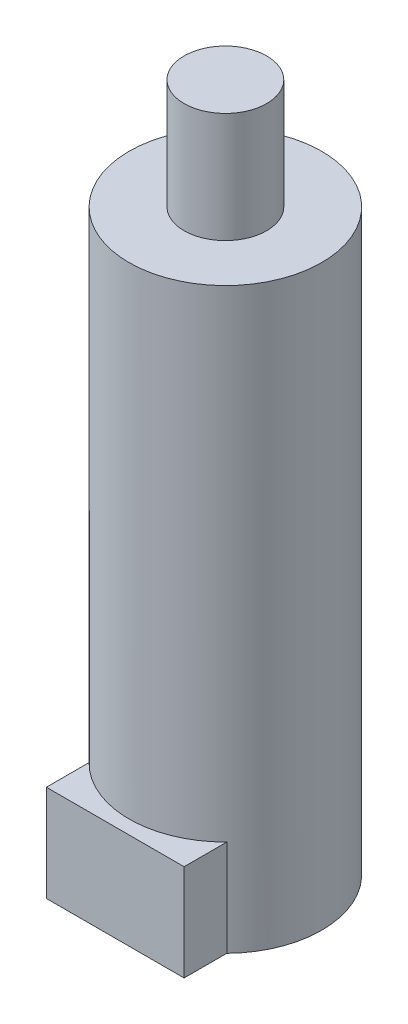
ISO-10303-21;
HEADER;
FILE_DESCRIPTION(('STEP AP214'),'2;1');
FILE_NAME('part.step','',(''),(''),'','','');
FILE_SCHEMA(('AUTOMOTIVE_DESIGN { 1 0 10303 214 1 1 1 1 }'));
ENDSEC;
DATA;
#1=APPLICATION_CONTEXT('core data for automotive mechanical design processes');
#2=APPLICATION_PROTOCOL_DEFINITION('international standard','automotive_design',2000,#1);
#3=PRODUCT_CONTEXT('',#1,'mechanical');
#4=PRODUCT('Part','Part','',(#3));
#5=PRODUCT_RELATED_PRODUCT_CATEGORY('part','',(#4));
#6=PRODUCT_DEFINITION_FORMATION('','',#4);
#7=PRODUCT_DEFINITION_CONTEXT('part definition',#1,'design');
#8=PRODUCT_DEFINITION('design','',#6,#7);
#9=PRODUCT_DEFINITION_SHAPE('','',#8);
#10=(LENGTH_UNIT() NAMED_UNIT(*) SI_UNIT(.MILLI.,.METRE.));
#11=(NAMED_UNIT(*) PLANE_ANGLE_UNIT() SI_UNIT($,.RADIAN.));
#12=(NAMED_UNIT(*) SI_UNIT($,.STERADIAN.) SOLID_ANGLE_UNIT());
#13=UNCERTAINTY_MEASURE_WITH_UNIT(LENGTH_MEASURE(1.E-05),#10,'distance_accuracy_value','');
#14=(GEOMETRIC_REPRESENTATION_CONTEXT(3) GLOBAL_UNCERTAINTY_ASSIGNED_CONTEXT((#13)) GLOBAL_UNIT_ASSIGNED_CONTEXT((#10,
#11,#12)) REPRESENTATION_CONTEXT('',''));
#15=CARTESIAN_POINT('',(0.,0.,0.));
#16=DIRECTION('',(0.,0.,1.));
#17=DIRECTION('',(1.,0.,0.));
#18=AXIS2_PLACEMENT_3D('',#15,#16,#17);
#19=CARTESIAN_POINT('',(0.,66.675,0.));
#20=DIRECTION('',(0.,-1.,0.));
#21=DIRECTION('',(0.,0.,-1.));
#22=AXIS2_PLACEMENT_3D('',#19,#20,#21);
#23=CYLINDRICAL_SURFACE('',#22,11.1125);
#24=CARTESIAN_POINT('',(0.,66.675,0.));
#25=DIRECTION('',(0.,1.,0.));
#26=DIRECTION('',(0.,0.,1.));
#27=AXIS2_PLACEMENT_3D('',#24,#25,#26);
#28=CIRCLE('',#27,11.1125);
#29=CARTESIAN_POINT('',(0.,66.675,11.1125));
#30=VERTEX_POINT('',#29);
#31=EDGE_CURVE('E127',#30,#30,#28,.T.);
#32=ORIENTED_EDGE('',*,*,#31,.F.);
#33=EDGE_LOOP('',(#32));
#34=FACE_BOUND('',#33,.T.);
#35=DIRECTION('',(0.,-1.,0.));
#36=VECTOR('',#35,1.);
#37=CARTESIAN_POINT('',(-7.9375,66.675,7.77712993333659));
#38=LINE('',#37,#36);
#39=CARTESIAN_POINT('',(-7.9375,11.1125,7.77712993333659));
#40=VERTEX_POINT('',#39);
#41=CARTESIAN_POINT('',(-7.9375,0.,7.77712993333659));
#42=VERTEX_POINT('',#41);
#43=EDGE_CURVE('E113',#40,#42,#38,.T.);
#44=ORIENTED_EDGE('',*,*,#43,.F.);
#45=CARTESIAN_POINT('',(0.,11.1125,0.));
#46=DIRECTION('',(0.,-1.,0.));
#47=DIRECTION('',(0.,0.,-1.));
#48=AXIS2_PLACEMENT_3D('',#45,#46,#47);
#49=CIRCLE('',#48,11.1125);
#50=CARTESIAN_POINT('',(7.9375,11.1125,7.77712993333659));
#51=VERTEX_POINT('',#50);
#52=EDGE_CURVE('E45',#51,#40,#49,.T.);
#53=ORIENTED_EDGE('',*,*,#52,.F.);
#54=DIRECTION('',(0.,-1.,0.));
#55=VECTOR('',#54,1.);
#56=CARTESIAN_POINT('',(7.9375,66.675,7.77712993333659));
#57=LINE('',#56,#55);
#58=CARTESIAN_POINT('',(7.9375,0.,7.77712993333659));
#59=VERTEX_POINT('',#58);
#60=EDGE_CURVE('E115',#59,#51,#57,.F.);
#61=ORIENTED_EDGE('',*,*,#60,.F.);
#62=CARTESIAN_POINT('',(0.,0.,0.));
#63=DIRECTION('',(0.,1.,0.));
#64=DIRECTION('',(0.,0.,1.));
#65=AXIS2_PLACEMENT_3D('',#62,#63,#64);
#66=CIRCLE('',#65,11.1125);
#67=EDGE_CURVE('E65',#59,#42,#66,.T.);
#68=ORIENTED_EDGE('',*,*,#67,.T.);
#69=EDGE_LOOP('',(#44,#53,#61,#68));
#70=FACE_BOUND('',#69,.T.);
#71=ADVANCED_FACE('F42',(#34,#70),#23,.T.);
#72=CARTESIAN_POINT('',(0.,66.675,0.));
#73=DIRECTION('',(0.,1.,0.));
#74=DIRECTION('',(0.,0.,1.));
#75=AXIS2_PLACEMENT_3D('',#72,#73,#74);
#76=PLANE('',#75);
#77=CARTESIAN_POINT('',(0.,66.675,0.));
#78=DIRECTION('',(0.,1.,0.));
#79=DIRECTION('',(0.,0.,1.));
#80=AXIS2_PLACEMENT_3D('',#77,#78,#79);
#81=CIRCLE('',#80,4.7625);
#82=CARTESIAN_POINT('',(0.,66.675,4.7625));
#83=VERTEX_POINT('',#82);
#84=EDGE_CURVE('E11',#83,#83,#81,.T.);
#85=ORIENTED_EDGE('',*,*,#84,.F.);
#86=EDGE_LOOP('',(#85));
#87=FACE_BOUND('',#86,.T.);
#88=ORIENTED_EDGE('',*,*,#31,.T.);
#89=EDGE_LOOP('',(#88));
#90=FACE_BOUND('',#89,.T.);
#91=ADVANCED_FACE('F156',(#87,#90),#76,.T.);
#92=CARTESIAN_POINT('',(0.,0.,0.));
#93=DIRECTION('',(0.,1.,0.));
#94=DIRECTION('',(0.,0.,1.));
#95=AXIS2_PLACEMENT_3D('',#92,#93,#94);
#96=PLANE('',#95);
#97=ORIENTED_EDGE('',*,*,#67,.F.);
#98=DIRECTION('',(0.,0.,-1.));
#99=VECTOR('',#98,1.);
#100=CARTESIAN_POINT('',(7.9375,0.,12.7));
#101=LINE('',#100,#99);
#102=CARTESIAN_POINT('',(7.9375,0.,12.7));
#103=VERTEX_POINT('',#102);
#104=EDGE_CURVE('E95',#103,#59,#101,.T.);
#105=ORIENTED_EDGE('',*,*,#104,.F.);
#106=DIRECTION('',(1.,0.,0.));
#107=VECTOR('',#106,1.);
#108=CARTESIAN_POINT('',(-7.9375,0.,12.7));
#109=LINE('',#108,#107);
#110=CARTESIAN_POINT('',(-7.9375,0.,12.7));
#111=VERTEX_POINT('',#110);
#112=EDGE_CURVE('E89',#111,#103,#109,.T.);
#113=ORIENTED_EDGE('',*,*,#112,.F.);
#114=DIRECTION('',(0.,0.,-1.));
#115=VECTOR('',#114,1.);
#116=CARTESIAN_POINT('',(-7.9375,0.,12.7));
#117=LINE('',#116,#115);
#118=EDGE_CURVE('E93',#111,#42,#117,.T.);
#119=ORIENTED_EDGE('',*,*,#118,.T.);
#120=EDGE_LOOP('',(#97,#105,#113,#119));
#121=FACE_BOUND('',#120,.T.);
#122=ADVANCED_FACE('F91',(#121),#96,.F.);
#123=CARTESIAN_POINT('',(-7.9375,0.,12.7));
#124=DIRECTION('',(1.,0.,0.));
#125=DIRECTION('',(0.,0.,-1.));
#126=AXIS2_PLACEMENT_3D('',#123,#124,#125);
#127=PLANE('',#126);
#128=DIRECTION('',(0.,0.,-1.));
#129=VECTOR('',#128,1.);
#130=CARTESIAN_POINT('',(-7.9375,11.1125,12.7));
#131=LINE('',#130,#129);
#132=CARTESIAN_POINT('',(-7.9375,11.1125,12.7));
#133=VERTEX_POINT('',#132);
#134=EDGE_CURVE('E138',#133,#40,#131,.T.);
#135=ORIENTED_EDGE('',*,*,#134,.T.);
#136=ORIENTED_EDGE('',*,*,#43,.T.);
#137=ORIENTED_EDGE('',*,*,#118,.F.);
#138=DIRECTION('',(0.,-1.,0.));
#139=VECTOR('',#138,1.);
#140=CARTESIAN_POINT('',(-7.9375,0.,12.7));
#141=LINE('',#140,#139);
#142=EDGE_CURVE('E100',#133,#111,#141,.T.);
#143=ORIENTED_EDGE('',*,*,#142,.F.);
#144=EDGE_LOOP('',(#135,#136,#137,#143));
#145=FACE_BOUND('',#144,.T.);
#146=ADVANCED_FACE('F112',(#145),#127,.F.);
#147=CARTESIAN_POINT('',(7.9375,0.,12.7));
#148=DIRECTION('',(-1.,0.,0.));
#149=DIRECTION('',(0.,0.,1.));
#150=AXIS2_PLACEMENT_3D('',#147,#148,#149);
#151=PLANE('',#150);
#152=ORIENTED_EDGE('',*,*,#104,.T.);
#153=ORIENTED_EDGE('',*,*,#60,.T.);
#154=DIRECTION('',(0.,0.,-1.));
#155=VECTOR('',#154,1.);
#156=CARTESIAN_POINT('',(7.9375,11.1125,12.7));
#157=LINE('',#156,#155);
#158=CARTESIAN_POINT('',(7.9375,11.1125,12.7));
#159=VERTEX_POINT('',#158);
#160=EDGE_CURVE('E121',#159,#51,#157,.T.);
#161=ORIENTED_EDGE('',*,*,#160,.F.);
#162=DIRECTION('',(0.,1.,0.));
#163=VECTOR('',#162,1.);
#164=CARTESIAN_POINT('',(7.9375,0.,12.7));
#165=LINE('',#164,#163);
#166=EDGE_CURVE('E99',#103,#159,#165,.T.);
#167=ORIENTED_EDGE('',*,*,#166,.F.);
#168=EDGE_LOOP('',(#152,#153,#161,#167));
#169=FACE_BOUND('',#168,.T.);
#170=ADVANCED_FACE('F168',(#169),#151,.F.);
#171=CARTESIAN_POINT('',(-7.9375,11.1125,12.7));
#172=DIRECTION('',(0.,-1.,0.));
#173=DIRECTION('',(0.,0.,-1.));
#174=AXIS2_PLACEMENT_3D('',#171,#172,#173);
#175=PLANE('',#174);
#176=ORIENTED_EDGE('',*,*,#160,.T.);
#177=ORIENTED_EDGE('',*,*,#52,.T.);
#178=ORIENTED_EDGE('',*,*,#134,.F.);
#179=DIRECTION('',(-1.,0.,0.));
#180=VECTOR('',#179,1.);
#181=CARTESIAN_POINT('',(-7.9375,11.1125,12.7));
#182=LINE('',#181,#180);
#183=EDGE_CURVE('E105',#159,#133,#182,.T.);
#184=ORIENTED_EDGE('',*,*,#183,.F.);
#185=EDGE_LOOP('',(#176,#177,#178,#184));
#186=FACE_BOUND('',#185,.T.);
#187=ADVANCED_FACE('F137',(#186),#175,.F.);
#188=CARTESIAN_POINT('',(0.,0.,12.7));
#189=DIRECTION('',(0.,0.,-1.));
#190=DIRECTION('',(-1.,0.,0.));
#191=AXIS2_PLACEMENT_3D('',#188,#189,#190);
#192=PLANE('',#191);
#193=ORIENTED_EDGE('',*,*,#142,.T.);
#194=ORIENTED_EDGE('',*,*,#112,.T.);
#195=ORIENTED_EDGE('',*,*,#166,.T.);
#196=ORIENTED_EDGE('',*,*,#183,.T.);
#197=EDGE_LOOP('',(#193,#194,#195,#196));
#198=FACE_BOUND('',#197,.T.);
#199=ADVANCED_FACE('F103',(#198),#192,.F.);
#200=CARTESIAN_POINT('',(0.,79.375,0.));
#201=DIRECTION('',(0.,-1.,0.));
#202=DIRECTION('',(0.,0.,-1.));
#203=AXIS2_PLACEMENT_3D('',#200,#201,#202);
#204=CYLINDRICAL_SURFACE('',#203,4.7625);
#205=CARTESIAN_POINT('',(0.,79.375,0.));
#206=DIRECTION('',(0.,1.,0.));
#207=DIRECTION('',(0.,0.,1.));
#208=AXIS2_PLACEMENT_3D('',#205,#206,#207);
#209=CIRCLE('',#208,4.7625);
#210=CARTESIAN_POINT('',(0.,79.375,4.7625));
#211=VERTEX_POINT('',#210);
#212=EDGE_CURVE('E110',#211,#211,#209,.T.);
#213=ORIENTED_EDGE('',*,*,#212,.F.);
#214=EDGE_LOOP('',(#213));
#215=FACE_BOUND('',#214,.T.);
#216=ORIENTED_EDGE('',*,*,#84,.T.);
#217=EDGE_LOOP('',(#216));
#218=FACE_BOUND('',#217,.T.);
#219=ADVANCED_FACE('F150',(#215,#218),#204,.T.);
#220=CARTESIAN_POINT('',(0.,79.375,0.));
#221=DIRECTION('',(0.,1.,0.));
#222=DIRECTION('',(0.,0.,1.));
#223=AXIS2_PLACEMENT_3D('',#220,#221,#222);
#224=PLANE('',#223);
#225=ORIENTED_EDGE('',*,*,#212,.T.);
#226=EDGE_LOOP('',(#225));
#227=FACE_BOUND('',#226,.T.);
#228=ADVANCED_FACE('F148',(#227),#224,.T.);
#229=CLOSED_SHELL('',(#71,#91,#122,#146,#170,#187,#199,#219,#228));
#230=MANIFOLD_SOLID_BREP('B2',#229);
#231=ADVANCED_BREP_SHAPE_REPRESENTATION('',(#18,#230),#14);
#232=SHAPE_DEFINITION_REPRESENTATION(#9,#231);
ENDSEC;
END-ISO-10303-21;
